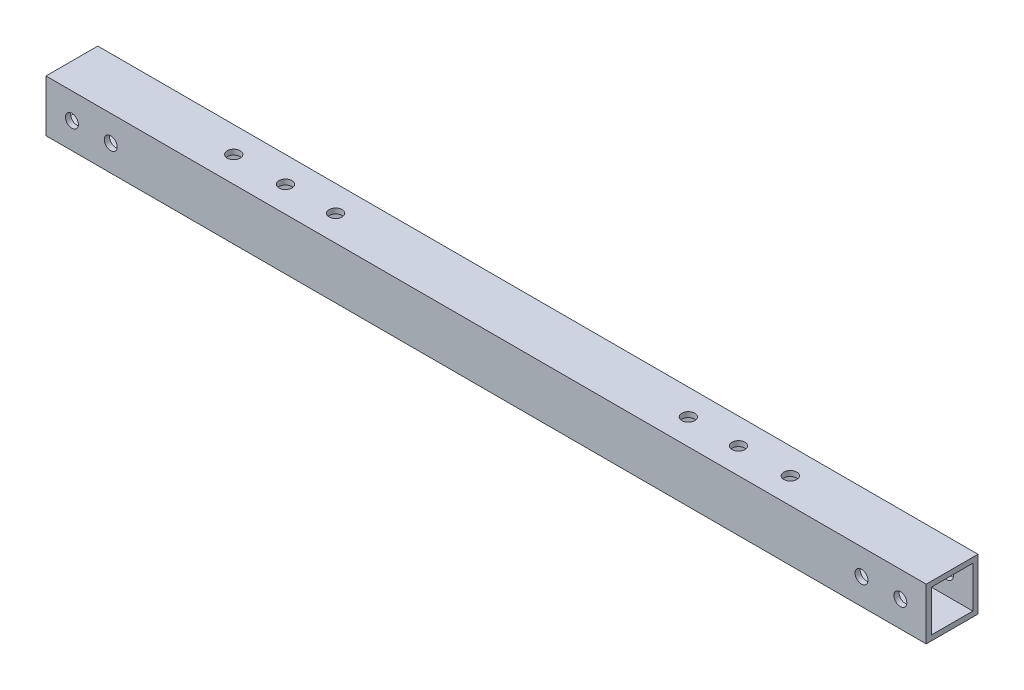
ISO-10303-21;
HEADER;
FILE_DESCRIPTION(('STEP AP214'),'2;1');
FILE_NAME('part.step','',(''),(''),'','','');
FILE_SCHEMA(('AUTOMOTIVE_DESIGN { 1 0 10303 214 1 1 1 1 }'));
ENDSEC;
DATA;
#1=APPLICATION_CONTEXT('core data for automotive mechanical design processes');
#2=APPLICATION_PROTOCOL_DEFINITION('international standard','automotive_design',2000,#1);
#3=PRODUCT_CONTEXT('',#1,'mechanical');
#4=PRODUCT('Part','Part','',(#3));
#5=PRODUCT_RELATED_PRODUCT_CATEGORY('part','',(#4));
#6=PRODUCT_DEFINITION_FORMATION('','',#4);
#7=PRODUCT_DEFINITION_CONTEXT('part definition',#1,'design');
#8=PRODUCT_DEFINITION('design','',#6,#7);
#9=PRODUCT_DEFINITION_SHAPE('','',#8);
#10=(LENGTH_UNIT() NAMED_UNIT(*) SI_UNIT(.MILLI.,.METRE.));
#11=(NAMED_UNIT(*) PLANE_ANGLE_UNIT() SI_UNIT($,.RADIAN.));
#12=(NAMED_UNIT(*) SI_UNIT($,.STERADIAN.) SOLID_ANGLE_UNIT());
#13=UNCERTAINTY_MEASURE_WITH_UNIT(LENGTH_MEASURE(1.E-05),#10,'distance_accuracy_value','');
#14=(GEOMETRIC_REPRESENTATION_CONTEXT(3) GLOBAL_UNCERTAINTY_ASSIGNED_CONTEXT((#13)) GLOBAL_UNIT_ASSIGNED_CONTEXT((#10,
#11,#12)) REPRESENTATION_CONTEXT('',''));
#15=CARTESIAN_POINT('',(0.,0.,0.));
#16=DIRECTION('',(0.,0.,1.));
#17=DIRECTION('',(1.,0.,0.));
#18=AXIS2_PLACEMENT_3D('',#15,#16,#17);
#19=CARTESIAN_POINT('',(340.,0.,0.));
#20=DIRECTION('',(1.,0.,0.));
#21=DIRECTION('',(0.,0.,-1.));
#22=AXIS2_PLACEMENT_3D('',#19,#20,#21);
#23=PLANE('',#22);
#24=DIRECTION('',(0.,1.,0.));
#25=VECTOR('',#24,1.);
#26=CARTESIAN_POINT('',(340.,10.,-10.));
#27=LINE('',#26,#25);
#28=CARTESIAN_POINT('',(340.,-10.,-10.));
#29=VERTEX_POINT('',#28);
#30=CARTESIAN_POINT('',(340.,10.,-10.));
#31=VERTEX_POINT('',#30);
#32=EDGE_CURVE('E141',#29,#31,#27,.T.);
#33=ORIENTED_EDGE('',*,*,#32,.T.);
#34=DIRECTION('',(0.,0.,1.));
#35=VECTOR('',#34,1.);
#36=CARTESIAN_POINT('',(340.,10.,10.));
#37=LINE('',#36,#35);
#38=CARTESIAN_POINT('',(340.,10.,10.));
#39=VERTEX_POINT('',#38);
#40=EDGE_CURVE('E144',#31,#39,#37,.T.);
#41=ORIENTED_EDGE('',*,*,#40,.T.);
#42=DIRECTION('',(0.,-1.,0.));
#43=VECTOR('',#42,1.);
#44=CARTESIAN_POINT('',(340.,10.,10.));
#45=LINE('',#44,#43);
#46=CARTESIAN_POINT('',(340.,-10.,10.));
#47=VERTEX_POINT('',#46);
#48=EDGE_CURVE('E147',#39,#47,#45,.T.);
#49=ORIENTED_EDGE('',*,*,#48,.T.);
#50=DIRECTION('',(0.,0.,-1.));
#51=VECTOR('',#50,1.);
#52=CARTESIAN_POINT('',(340.,-10.,10.));
#53=LINE('',#52,#51);
#54=EDGE_CURVE('E149',#47,#29,#53,.T.);
#55=ORIENTED_EDGE('',*,*,#54,.T.);
#56=EDGE_LOOP('',(#33,#41,#49,#55));
#57=FACE_BOUND('',#56,.T.);
#58=DIRECTION('',(0.,0.,1.));
#59=VECTOR('',#58,1.);
#60=CARTESIAN_POINT('',(340.,8.,8.));
#61=LINE('',#60,#59);
#62=CARTESIAN_POINT('',(340.,8.,-8.));
#63=VERTEX_POINT('',#62);
#64=CARTESIAN_POINT('',(340.,8.,8.));
#65=VERTEX_POINT('',#64);
#66=EDGE_CURVE('E111',#63,#65,#61,.T.);
#67=ORIENTED_EDGE('',*,*,#66,.F.);
#68=DIRECTION('',(0.,1.,0.));
#69=VECTOR('',#68,1.);
#70=CARTESIAN_POINT('',(340.,8.,-8.));
#71=LINE('',#70,#69);
#72=CARTESIAN_POINT('',(340.,-8.,-8.));
#73=VERTEX_POINT('',#72);
#74=EDGE_CURVE('E103',#73,#63,#71,.T.);
#75=ORIENTED_EDGE('',*,*,#74,.F.);
#76=DIRECTION('',(0.,0.,-1.));
#77=VECTOR('',#76,1.);
#78=CARTESIAN_POINT('',(340.,-8.,8.));
#79=LINE('',#78,#77);
#80=CARTESIAN_POINT('',(340.,-8.,8.));
#81=VERTEX_POINT('',#80);
#82=EDGE_CURVE('E125',#81,#73,#79,.T.);
#83=ORIENTED_EDGE('',*,*,#82,.F.);
#84=DIRECTION('',(0.,-1.,0.));
#85=VECTOR('',#84,1.);
#86=CARTESIAN_POINT('',(340.,8.,8.));
#87=LINE('',#86,#85);
#88=EDGE_CURVE('E123',#65,#81,#87,.T.);
#89=ORIENTED_EDGE('',*,*,#88,.F.);
#90=EDGE_LOOP('',(#67,#75,#83,#89));
#91=FACE_BOUND('',#90,.T.);
#92=ADVANCED_FACE('F36',(#57,#91),#23,.T.);
#93=CARTESIAN_POINT('',(0.,0.,0.));
#94=DIRECTION('',(1.,0.,0.));
#95=DIRECTION('',(0.,0.,-1.));
#96=AXIS2_PLACEMENT_3D('',#93,#94,#95);
#97=PLANE('',#96);
#98=DIRECTION('',(0.,1.,0.));
#99=VECTOR('',#98,1.);
#100=CARTESIAN_POINT('',(0.,10.,-10.));
#101=LINE('',#100,#99);
#102=CARTESIAN_POINT('',(0.,-10.,-10.));
#103=VERTEX_POINT('',#102);
#104=CARTESIAN_POINT('',(0.,10.,-10.));
#105=VERTEX_POINT('',#104);
#106=EDGE_CURVE('E119',#103,#105,#101,.T.);
#107=ORIENTED_EDGE('',*,*,#106,.F.);
#108=DIRECTION('',(0.,0.,-1.));
#109=VECTOR('',#108,1.);
#110=CARTESIAN_POINT('',(0.,-10.,10.));
#111=LINE('',#110,#109);
#112=CARTESIAN_POINT('',(0.,-10.,10.));
#113=VERTEX_POINT('',#112);
#114=EDGE_CURVE('E145',#113,#103,#111,.T.);
#115=ORIENTED_EDGE('',*,*,#114,.F.);
#116=DIRECTION('',(0.,-1.,0.));
#117=VECTOR('',#116,1.);
#118=CARTESIAN_POINT('',(0.,10.,10.));
#119=LINE('',#118,#117);
#120=CARTESIAN_POINT('',(0.,10.,10.));
#121=VERTEX_POINT('',#120);
#122=EDGE_CURVE('E156',#121,#113,#119,.T.);
#123=ORIENTED_EDGE('',*,*,#122,.F.);
#124=DIRECTION('',(0.,0.,1.));
#125=VECTOR('',#124,1.);
#126=CARTESIAN_POINT('',(0.,10.,10.));
#127=LINE('',#126,#125);
#128=EDGE_CURVE('E154',#105,#121,#127,.T.);
#129=ORIENTED_EDGE('',*,*,#128,.F.);
#130=EDGE_LOOP('',(#107,#115,#123,#129));
#131=FACE_BOUND('',#130,.T.);
#132=DIRECTION('',(0.,1.,0.));
#133=VECTOR('',#132,1.);
#134=CARTESIAN_POINT('',(0.,8.,-8.));
#135=LINE('',#134,#133);
#136=CARTESIAN_POINT('',(0.,-8.,-8.));
#137=VERTEX_POINT('',#136);
#138=CARTESIAN_POINT('',(0.,8.,-8.));
#139=VERTEX_POINT('',#138);
#140=EDGE_CURVE('E61',#137,#139,#135,.T.);
#141=ORIENTED_EDGE('',*,*,#140,.T.);
#142=DIRECTION('',(0.,0.,1.));
#143=VECTOR('',#142,1.);
#144=CARTESIAN_POINT('',(0.,8.,8.));
#145=LINE('',#144,#143);
#146=CARTESIAN_POINT('',(0.,8.,8.));
#147=VERTEX_POINT('',#146);
#148=EDGE_CURVE('E118',#139,#147,#145,.T.);
#149=ORIENTED_EDGE('',*,*,#148,.T.);
#150=DIRECTION('',(0.,-1.,0.));
#151=VECTOR('',#150,1.);
#152=CARTESIAN_POINT('',(0.,8.,8.));
#153=LINE('',#152,#151);
#154=CARTESIAN_POINT('',(0.,-8.,8.));
#155=VERTEX_POINT('',#154);
#156=EDGE_CURVE('E133',#147,#155,#153,.T.);
#157=ORIENTED_EDGE('',*,*,#156,.T.);
#158=DIRECTION('',(0.,0.,-1.));
#159=VECTOR('',#158,1.);
#160=CARTESIAN_POINT('',(0.,-8.,8.));
#161=LINE('',#160,#159);
#162=EDGE_CURVE('E112',#155,#137,#161,.T.);
#163=ORIENTED_EDGE('',*,*,#162,.T.);
#164=EDGE_LOOP('',(#141,#149,#157,#163));
#165=FACE_BOUND('',#164,.T.);
#166=ADVANCED_FACE('F310',(#131,#165),#97,.F.);
#167=CARTESIAN_POINT('',(340.,10.,-10.));
#168=DIRECTION('',(0.,0.,1.));
#169=DIRECTION('',(1.,0.,0.));
#170=AXIS2_PLACEMENT_3D('',#167,#168,#169);
#171=PLANE('',#170);
#172=CARTESIAN_POINT('',(10.,0.,-10.));
#173=DIRECTION('',(0.,0.,1.));
#174=DIRECTION('',(1.,0.,0.));
#175=AXIS2_PLACEMENT_3D('',#172,#173,#174);
#176=CIRCLE('',#175,2.5);
#177=CARTESIAN_POINT('',(12.5,0.,-10.));
#178=VERTEX_POINT('',#177);
#179=EDGE_CURVE('E170',#178,#178,#176,.T.);
#180=ORIENTED_EDGE('',*,*,#179,.T.);
#181=EDGE_LOOP('',(#180));
#182=FACE_BOUND('',#181,.T.);
#183=CARTESIAN_POINT('',(25.,0.,-10.));
#184=DIRECTION('',(0.,0.,1.));
#185=DIRECTION('',(1.,0.,0.));
#186=AXIS2_PLACEMENT_3D('',#183,#184,#185);
#187=CIRCLE('',#186,2.5);
#188=CARTESIAN_POINT('',(27.5,0.,-10.));
#189=VERTEX_POINT('',#188);
#190=EDGE_CURVE('E260',#189,#189,#187,.T.);
#191=ORIENTED_EDGE('',*,*,#190,.T.);
#192=EDGE_LOOP('',(#191));
#193=FACE_BOUND('',#192,.T.);
#194=CARTESIAN_POINT('',(315.,1.0654427152582E-13,-10.));
#195=DIRECTION('',(0.,0.,1.));
#196=DIRECTION('',(-1.,0.,0.));
#197=AXIS2_PLACEMENT_3D('',#194,#195,#196);
#198=CIRCLE('',#197,2.49999999999996);
#199=CARTESIAN_POINT('',(312.5,1.0654427152582E-13,-10.));
#200=VERTEX_POINT('',#199);
#201=EDGE_CURVE('E266',#200,#200,#198,.T.);
#202=ORIENTED_EDGE('',*,*,#201,.T.);
#203=EDGE_LOOP('',(#202));
#204=FACE_BOUND('',#203,.T.);
#205=CARTESIAN_POINT('',(330.,1.17566092718146E-13,-10.));
#206=DIRECTION('',(0.,0.,1.));
#207=DIRECTION('',(-1.,0.,0.));
#208=AXIS2_PLACEMENT_3D('',#205,#206,#207);
#209=CIRCLE('',#208,2.50000000000002);
#210=CARTESIAN_POINT('',(327.5,1.17566092718146E-13,-10.));
#211=VERTEX_POINT('',#210);
#212=EDGE_CURVE('E272',#211,#211,#209,.T.);
#213=ORIENTED_EDGE('',*,*,#212,.T.);
#214=EDGE_LOOP('',(#213));
#215=FACE_BOUND('',#214,.T.);
#216=ORIENTED_EDGE('',*,*,#106,.T.);
#217=DIRECTION('',(-1.,0.,0.));
#218=VECTOR('',#217,1.);
#219=CARTESIAN_POINT('',(340.,10.,-10.));
#220=LINE('',#219,#218);
#221=EDGE_CURVE('E11',#31,#105,#220,.T.);
#222=ORIENTED_EDGE('',*,*,#221,.F.);
#223=ORIENTED_EDGE('',*,*,#32,.F.);
#224=DIRECTION('',(-1.,0.,0.));
#225=VECTOR('',#224,1.);
#226=CARTESIAN_POINT('',(340.,-10.,-10.));
#227=LINE('',#226,#225);
#228=EDGE_CURVE('E151',#29,#103,#227,.T.);
#229=ORIENTED_EDGE('',*,*,#228,.T.);
#230=EDGE_LOOP('',(#216,#222,#223,#229));
#231=FACE_BOUND('',#230,.T.);
#232=ADVANCED_FACE('F38',(#182,#193,#204,#215,#231),#171,.F.);
#233=CARTESIAN_POINT('',(340.,10.,10.));
#234=DIRECTION('',(0.,-1.,0.));
#235=DIRECTION('',(0.,0.,-1.));
#236=AXIS2_PLACEMENT_3D('',#233,#234,#235);
#237=PLANE('',#236);
#238=CARTESIAN_POINT('',(101.88,10.,0.));
#239=DIRECTION('',(0.,1.,0.));
#240=DIRECTION('',(0.,0.,1.));
#241=AXIS2_PLACEMENT_3D('',#238,#239,#240);
#242=CIRCLE('',#241,2.49999999999999);
#243=CARTESIAN_POINT('',(101.88,10.,2.49999999999999));
#244=VERTEX_POINT('',#243);
#245=EDGE_CURVE('E207',#244,#244,#242,.T.);
#246=ORIENTED_EDGE('',*,*,#245,.F.);
#247=EDGE_LOOP('',(#246));
#248=FACE_BOUND('',#247,.T.);
#249=CARTESIAN_POINT('',(238.12,10.,0.));
#250=DIRECTION('',(0.,1.,0.));
#251=DIRECTION('',(0.,0.,-1.));
#252=AXIS2_PLACEMENT_3D('',#249,#250,#251);
#253=CIRCLE('',#252,2.50000000000002);
#254=CARTESIAN_POINT('',(238.12,10.,-2.50000000000002));
#255=VERTEX_POINT('',#254);
#256=EDGE_CURVE('E217',#255,#255,#253,.T.);
#257=ORIENTED_EDGE('',*,*,#256,.F.);
#258=EDGE_LOOP('',(#257));
#259=FACE_BOUND('',#258,.T.);
#260=CARTESIAN_POINT('',(62.5,10.,0.));
#261=DIRECTION('',(0.,1.,0.));
#262=DIRECTION('',(0.,0.,1.));
#263=AXIS2_PLACEMENT_3D('',#260,#261,#262);
#264=CIRCLE('',#263,2.5);
#265=CARTESIAN_POINT('',(62.5,10.,2.5));
#266=VERTEX_POINT('',#265);
#267=EDGE_CURVE('E226',#266,#266,#264,.T.);
#268=ORIENTED_EDGE('',*,*,#267,.F.);
#269=EDGE_LOOP('',(#268));
#270=FACE_BOUND('',#269,.T.);
#271=CARTESIAN_POINT('',(82.5,10.,0.));
#272=DIRECTION('',(0.,1.,0.));
#273=DIRECTION('',(0.,0.,-1.));
#274=AXIS2_PLACEMENT_3D('',#271,#272,#273);
#275=CIRCLE('',#274,2.5);
#276=CARTESIAN_POINT('',(82.5,10.,-2.49999999999999));
#277=VERTEX_POINT('',#276);
#278=EDGE_CURVE('E232',#277,#277,#275,.T.);
#279=ORIENTED_EDGE('',*,*,#278,.F.);
#280=EDGE_LOOP('',(#279));
#281=FACE_BOUND('',#280,.T.);
#282=CARTESIAN_POINT('',(257.5,10.,0.));
#283=DIRECTION('',(0.,1.,0.));
#284=DIRECTION('',(0.,0.,1.));
#285=AXIS2_PLACEMENT_3D('',#282,#283,#284);
#286=CIRCLE('',#285,2.49999999999997);
#287=CARTESIAN_POINT('',(257.5,10.,2.49999999999997));
#288=VERTEX_POINT('',#287);
#289=EDGE_CURVE('E238',#288,#288,#286,.T.);
#290=ORIENTED_EDGE('',*,*,#289,.F.);
#291=EDGE_LOOP('',(#290));
#292=FACE_BOUND('',#291,.T.);
#293=CARTESIAN_POINT('',(277.5,10.,0.));
#294=DIRECTION('',(0.,1.,0.));
#295=DIRECTION('',(0.,0.,-1.));
#296=AXIS2_PLACEMENT_3D('',#293,#294,#295);
#297=CIRCLE('',#296,2.49999999999997);
#298=CARTESIAN_POINT('',(277.5,10.,-2.49999999999997));
#299=VERTEX_POINT('',#298);
#300=EDGE_CURVE('E223',#299,#299,#297,.T.);
#301=ORIENTED_EDGE('',*,*,#300,.F.);
#302=EDGE_LOOP('',(#301));
#303=FACE_BOUND('',#302,.T.);
#304=ORIENTED_EDGE('',*,*,#128,.T.);
#305=DIRECTION('',(-1.,0.,0.));
#306=VECTOR('',#305,1.);
#307=CARTESIAN_POINT('',(340.,10.,10.));
#308=LINE('',#307,#306);
#309=EDGE_CURVE('E45',#39,#121,#308,.T.);
#310=ORIENTED_EDGE('',*,*,#309,.F.);
#311=ORIENTED_EDGE('',*,*,#40,.F.);
#312=ORIENTED_EDGE('',*,*,#221,.T.);
#313=EDGE_LOOP('',(#304,#310,#311,#312));
#314=FACE_BOUND('',#313,.T.);
#315=ADVANCED_FACE('F309',(#248,#259,#270,#281,#292,#303,#314),#237,.F.);
#316=CARTESIAN_POINT('',(340.,10.,10.));
#317=DIRECTION('',(0.,0.,-1.));
#318=DIRECTION('',(-1.,0.,0.));
#319=AXIS2_PLACEMENT_3D('',#316,#317,#318);
#320=PLANE('',#319);
#321=CARTESIAN_POINT('',(10.,0.,10.));
#322=DIRECTION('',(0.,0.,1.));
#323=DIRECTION('',(1.,0.,0.));
#324=AXIS2_PLACEMENT_3D('',#321,#322,#323);
#325=CIRCLE('',#324,2.5);
#326=CARTESIAN_POINT('',(12.5,0.,10.));
#327=VERTEX_POINT('',#326);
#328=EDGE_CURVE('E257',#327,#327,#325,.T.);
#329=ORIENTED_EDGE('',*,*,#328,.F.);
#330=EDGE_LOOP('',(#329));
#331=FACE_BOUND('',#330,.T.);
#332=CARTESIAN_POINT('',(25.,0.,10.));
#333=DIRECTION('',(0.,0.,1.));
#334=DIRECTION('',(1.,0.,0.));
#335=AXIS2_PLACEMENT_3D('',#332,#333,#334);
#336=CIRCLE('',#335,2.5);
#337=CARTESIAN_POINT('',(27.5,0.,10.));
#338=VERTEX_POINT('',#337);
#339=EDGE_CURVE('E263',#338,#338,#336,.T.);
#340=ORIENTED_EDGE('',*,*,#339,.F.);
#341=EDGE_LOOP('',(#340));
#342=FACE_BOUND('',#341,.T.);
#343=CARTESIAN_POINT('',(315.,1.0654427152582E-13,10.));
#344=DIRECTION('',(0.,0.,1.));
#345=DIRECTION('',(-1.,0.,0.));
#346=AXIS2_PLACEMENT_3D('',#343,#344,#345);
#347=CIRCLE('',#346,2.49999999999996);
#348=CARTESIAN_POINT('',(312.5,1.0654427152582E-13,10.));
#349=VERTEX_POINT('',#348);
#350=EDGE_CURVE('E269',#349,#349,#347,.T.);
#351=ORIENTED_EDGE('',*,*,#350,.F.);
#352=EDGE_LOOP('',(#351));
#353=FACE_BOUND('',#352,.T.);
#354=CARTESIAN_POINT('',(330.,1.17566092718146E-13,10.));
#355=DIRECTION('',(0.,0.,1.));
#356=DIRECTION('',(-1.,0.,0.));
#357=AXIS2_PLACEMENT_3D('',#354,#355,#356);
#358=CIRCLE('',#357,2.50000000000002);
#359=CARTESIAN_POINT('',(327.5,1.17566092718146E-13,10.));
#360=VERTEX_POINT('',#359);
#361=EDGE_CURVE('E254',#360,#360,#358,.T.);
#362=ORIENTED_EDGE('',*,*,#361,.F.);
#363=EDGE_LOOP('',(#362));
#364=FACE_BOUND('',#363,.T.);
#365=ORIENTED_EDGE('',*,*,#122,.T.);
#366=DIRECTION('',(-1.,0.,0.));
#367=VECTOR('',#366,1.);
#368=CARTESIAN_POINT('',(340.,-10.,10.));
#369=LINE('',#368,#367);
#370=EDGE_CURVE('E161',#47,#113,#369,.T.);
#371=ORIENTED_EDGE('',*,*,#370,.F.);
#372=ORIENTED_EDGE('',*,*,#48,.F.);
#373=ORIENTED_EDGE('',*,*,#309,.T.);
#374=EDGE_LOOP('',(#365,#371,#372,#373));
#375=FACE_BOUND('',#374,.T.);
#376=ADVANCED_FACE('F328',(#331,#342,#353,#364,#375),#320,.F.);
#377=CARTESIAN_POINT('',(340.,-10.,10.));
#378=DIRECTION('',(0.,1.,0.));
#379=DIRECTION('',(0.,0.,1.));
#380=AXIS2_PLACEMENT_3D('',#377,#378,#379);
#381=PLANE('',#380);
#382=CARTESIAN_POINT('',(101.88,-9.99999999999999,0.));
#383=DIRECTION('',(0.,1.,0.));
#384=DIRECTION('',(0.,0.,1.));
#385=AXIS2_PLACEMENT_3D('',#382,#383,#384);
#386=CIRCLE('',#385,2.49999999999999);
#387=CARTESIAN_POINT('',(101.88,-9.99999999999999,2.49999999999999));
#388=VERTEX_POINT('',#387);
#389=EDGE_CURVE('E201',#388,#388,#386,.T.);
#390=ORIENTED_EDGE('',*,*,#389,.T.);
#391=EDGE_LOOP('',(#390));
#392=FACE_BOUND('',#391,.T.);
#393=CARTESIAN_POINT('',(238.12,-9.99999999999999,0.));
#394=DIRECTION('',(0.,1.,0.));
#395=DIRECTION('',(0.,0.,-1.));
#396=AXIS2_PLACEMENT_3D('',#393,#394,#395);
#397=CIRCLE('',#396,2.50000000000002);
#398=CARTESIAN_POINT('',(238.12,-9.99999999999999,-2.50000000000002));
#399=VERTEX_POINT('',#398);
#400=EDGE_CURVE('E212',#399,#399,#397,.T.);
#401=ORIENTED_EDGE('',*,*,#400,.T.);
#402=EDGE_LOOP('',(#401));
#403=FACE_BOUND('',#402,.T.);
#404=CARTESIAN_POINT('',(62.5,-9.99999999999999,0.));
#405=DIRECTION('',(0.,1.,0.));
#406=DIRECTION('',(0.,0.,1.));
#407=AXIS2_PLACEMENT_3D('',#404,#405,#406);
#408=CIRCLE('',#407,2.5);
#409=CARTESIAN_POINT('',(62.5,-9.99999999999999,2.49999999999999));
#410=VERTEX_POINT('',#409);
#411=EDGE_CURVE('E186',#410,#410,#408,.T.);
#412=ORIENTED_EDGE('',*,*,#411,.T.);
#413=EDGE_LOOP('',(#412));
#414=FACE_BOUND('',#413,.T.);
#415=CARTESIAN_POINT('',(82.5,-9.99999999999999,0.));
#416=DIRECTION('',(0.,1.,0.));
#417=DIRECTION('',(0.,0.,-1.));
#418=AXIS2_PLACEMENT_3D('',#415,#416,#417);
#419=CIRCLE('',#418,2.5);
#420=CARTESIAN_POINT('',(82.5,-9.99999999999999,-2.5));
#421=VERTEX_POINT('',#420);
#422=EDGE_CURVE('E229',#421,#421,#419,.T.);
#423=ORIENTED_EDGE('',*,*,#422,.T.);
#424=EDGE_LOOP('',(#423));
#425=FACE_BOUND('',#424,.T.);
#426=CARTESIAN_POINT('',(257.5,-9.99999999999999,0.));
#427=DIRECTION('',(0.,1.,0.));
#428=DIRECTION('',(0.,0.,1.));
#429=AXIS2_PLACEMENT_3D('',#426,#427,#428);
#430=CIRCLE('',#429,2.49999999999997);
#431=CARTESIAN_POINT('',(257.5,-9.99999999999999,2.49999999999997));
#432=VERTEX_POINT('',#431);
#433=EDGE_CURVE('E235',#432,#432,#430,.T.);
#434=ORIENTED_EDGE('',*,*,#433,.T.);
#435=EDGE_LOOP('',(#434));
#436=FACE_BOUND('',#435,.T.);
#437=CARTESIAN_POINT('',(277.5,-9.99999999999999,0.));
#438=DIRECTION('',(0.,1.,0.));
#439=DIRECTION('',(0.,0.,-1.));
#440=AXIS2_PLACEMENT_3D('',#437,#438,#439);
#441=CIRCLE('',#440,2.49999999999997);
#442=CARTESIAN_POINT('',(277.5,-9.99999999999999,-2.49999999999997));
#443=VERTEX_POINT('',#442);
#444=EDGE_CURVE('E241',#443,#443,#441,.T.);
#445=ORIENTED_EDGE('',*,*,#444,.T.);
#446=EDGE_LOOP('',(#445));
#447=FACE_BOUND('',#446,.T.);
#448=ORIENTED_EDGE('',*,*,#114,.T.);
#449=ORIENTED_EDGE('',*,*,#228,.F.);
#450=ORIENTED_EDGE('',*,*,#54,.F.);
#451=ORIENTED_EDGE('',*,*,#370,.T.);
#452=EDGE_LOOP('',(#448,#449,#450,#451));
#453=FACE_BOUND('',#452,.T.);
#454=ADVANCED_FACE('F290',(#392,#403,#414,#425,#436,#447,#453),#381,.F.);
#455=CARTESIAN_POINT('',(340.,8.,-8.));
#456=DIRECTION('',(0.,0.,1.));
#457=DIRECTION('',(1.,0.,0.));
#458=AXIS2_PLACEMENT_3D('',#455,#456,#457);
#459=PLANE('',#458);
#460=CARTESIAN_POINT('',(10.,0.,-8.));
#461=DIRECTION('',(0.,0.,1.));
#462=DIRECTION('',(1.,0.,0.));
#463=AXIS2_PLACEMENT_3D('',#460,#461,#462);
#464=CIRCLE('',#463,2.5);
#465=CARTESIAN_POINT('',(12.5,0.,-8.));
#466=VERTEX_POINT('',#465);
#467=EDGE_CURVE('E131',#466,#466,#464,.T.);
#468=ORIENTED_EDGE('',*,*,#467,.F.);
#469=EDGE_LOOP('',(#468));
#470=FACE_BOUND('',#469,.T.);
#471=CARTESIAN_POINT('',(25.,0.,-8.));
#472=DIRECTION('',(0.,0.,1.));
#473=DIRECTION('',(1.,0.,0.));
#474=AXIS2_PLACEMENT_3D('',#471,#472,#473);
#475=CIRCLE('',#474,2.5);
#476=CARTESIAN_POINT('',(27.5,0.,-8.));
#477=VERTEX_POINT('',#476);
#478=EDGE_CURVE('E178',#477,#477,#475,.T.);
#479=ORIENTED_EDGE('',*,*,#478,.F.);
#480=EDGE_LOOP('',(#479));
#481=FACE_BOUND('',#480,.T.);
#482=CARTESIAN_POINT('',(315.,1.0654427152582E-13,-8.));
#483=DIRECTION('',(0.,0.,1.));
#484=DIRECTION('',(1.,0.,0.));
#485=AXIS2_PLACEMENT_3D('',#482,#483,#484);
#486=CIRCLE('',#485,2.49999999999996);
#487=CARTESIAN_POINT('',(317.5,1.0654427152582E-13,-8.));
#488=VERTEX_POINT('',#487);
#489=EDGE_CURVE('E174',#488,#488,#486,.T.);
#490=ORIENTED_EDGE('',*,*,#489,.F.);
#491=EDGE_LOOP('',(#490));
#492=FACE_BOUND('',#491,.T.);
#493=CARTESIAN_POINT('',(330.,1.17566092718146E-13,-8.));
#494=DIRECTION('',(0.,0.,1.));
#495=DIRECTION('',(1.,0.,0.));
#496=AXIS2_PLACEMENT_3D('',#493,#494,#495);
#497=CIRCLE('',#496,2.50000000000002);
#498=CARTESIAN_POINT('',(332.5,1.17566092718146E-13,-8.));
#499=VERTEX_POINT('',#498);
#500=EDGE_CURVE('E169',#499,#499,#497,.T.);
#501=ORIENTED_EDGE('',*,*,#500,.F.);
#502=EDGE_LOOP('',(#501));
#503=FACE_BOUND('',#502,.T.);
#504=ORIENTED_EDGE('',*,*,#140,.F.);
#505=DIRECTION('',(-1.,0.,0.));
#506=VECTOR('',#505,1.);
#507=CARTESIAN_POINT('',(340.,-8.,-8.));
#508=LINE('',#507,#506);
#509=EDGE_CURVE('E107',#73,#137,#508,.T.);
#510=ORIENTED_EDGE('',*,*,#509,.F.);
#511=ORIENTED_EDGE('',*,*,#74,.T.);
#512=DIRECTION('',(-1.,0.,0.));
#513=VECTOR('',#512,1.);
#514=CARTESIAN_POINT('',(340.,8.,-8.));
#515=LINE('',#514,#513);
#516=EDGE_CURVE('E106',#63,#139,#515,.T.);
#517=ORIENTED_EDGE('',*,*,#516,.T.);
#518=EDGE_LOOP('',(#504,#510,#511,#517));
#519=FACE_BOUND('',#518,.T.);
#520=ADVANCED_FACE('F105',(#470,#481,#492,#503,#519),#459,.T.);
#521=CARTESIAN_POINT('',(340.,8.,8.));
#522=DIRECTION('',(0.,-1.,0.));
#523=DIRECTION('',(0.,0.,-1.));
#524=AXIS2_PLACEMENT_3D('',#521,#522,#523);
#525=PLANE('',#524);
#526=CARTESIAN_POINT('',(101.88,8.,0.));
#527=DIRECTION('',(0.,-1.,0.));
#528=DIRECTION('',(0.,0.,-1.));
#529=AXIS2_PLACEMENT_3D('',#526,#527,#528);
#530=CIRCLE('',#529,2.49999999999999);
#531=CARTESIAN_POINT('',(101.88,8.,-2.49999999999999));
#532=VERTEX_POINT('',#531);
#533=EDGE_CURVE('E220',#532,#532,#530,.T.);
#534=ORIENTED_EDGE('',*,*,#533,.F.);
#535=EDGE_LOOP('',(#534));
#536=FACE_BOUND('',#535,.T.);
#537=CARTESIAN_POINT('',(238.12,8.,0.));
#538=DIRECTION('',(0.,-1.,0.));
#539=DIRECTION('',(0.,0.,-1.));
#540=AXIS2_PLACEMENT_3D('',#537,#538,#539);
#541=CIRCLE('',#540,2.50000000000002);
#542=CARTESIAN_POINT('',(238.12,8.,-2.50000000000002));
#543=VERTEX_POINT('',#542);
#544=EDGE_CURVE('E200',#543,#543,#541,.T.);
#545=ORIENTED_EDGE('',*,*,#544,.F.);
#546=EDGE_LOOP('',(#545));
#547=FACE_BOUND('',#546,.T.);
#548=CARTESIAN_POINT('',(62.5,8.,0.));
#549=DIRECTION('',(0.,-1.,0.));
#550=DIRECTION('',(0.,0.,-1.));
#551=AXIS2_PLACEMENT_3D('',#548,#549,#550);
#552=CIRCLE('',#551,2.5);
#553=CARTESIAN_POINT('',(62.5,8.,-2.49999999999999));
#554=VERTEX_POINT('',#553);
#555=EDGE_CURVE('E197',#554,#554,#552,.T.);
#556=ORIENTED_EDGE('',*,*,#555,.F.);
#557=EDGE_LOOP('',(#556));
#558=FACE_BOUND('',#557,.T.);
#559=CARTESIAN_POINT('',(82.5,8.,0.));
#560=DIRECTION('',(0.,-1.,0.));
#561=DIRECTION('',(0.,0.,-1.));
#562=AXIS2_PLACEMENT_3D('',#559,#560,#561);
#563=CIRCLE('',#562,2.5);
#564=CARTESIAN_POINT('',(82.5,8.,-2.49999999999999));
#565=VERTEX_POINT('',#564);
#566=EDGE_CURVE('E194',#565,#565,#563,.T.);
#567=ORIENTED_EDGE('',*,*,#566,.F.);
#568=EDGE_LOOP('',(#567));
#569=FACE_BOUND('',#568,.T.);
#570=CARTESIAN_POINT('',(257.5,8.,0.));
#571=DIRECTION('',(0.,-1.,0.));
#572=DIRECTION('',(0.,0.,-1.));
#573=AXIS2_PLACEMENT_3D('',#570,#571,#572);
#574=CIRCLE('',#573,2.49999999999997);
#575=CARTESIAN_POINT('',(257.5,8.,-2.49999999999997));
#576=VERTEX_POINT('',#575);
#577=EDGE_CURVE('E190',#576,#576,#574,.T.);
#578=ORIENTED_EDGE('',*,*,#577,.F.);
#579=EDGE_LOOP('',(#578));
#580=FACE_BOUND('',#579,.T.);
#581=CARTESIAN_POINT('',(277.5,8.,0.));
#582=DIRECTION('',(0.,-1.,0.));
#583=DIRECTION('',(0.,0.,-1.));
#584=AXIS2_PLACEMENT_3D('',#581,#582,#583);
#585=CIRCLE('',#584,2.49999999999997);
#586=CARTESIAN_POINT('',(277.5,8.,-2.49999999999997));
#587=VERTEX_POINT('',#586);
#588=EDGE_CURVE('E185',#587,#587,#585,.T.);
#589=ORIENTED_EDGE('',*,*,#588,.F.);
#590=EDGE_LOOP('',(#589));
#591=FACE_BOUND('',#590,.T.);
#592=ORIENTED_EDGE('',*,*,#148,.F.);
#593=ORIENTED_EDGE('',*,*,#516,.F.);
#594=ORIENTED_EDGE('',*,*,#66,.T.);
#595=DIRECTION('',(-1.,0.,0.));
#596=VECTOR('',#595,1.);
#597=CARTESIAN_POINT('',(340.,8.,8.));
#598=LINE('',#597,#596);
#599=EDGE_CURVE('E120',#65,#147,#598,.T.);
#600=ORIENTED_EDGE('',*,*,#599,.T.);
#601=EDGE_LOOP('',(#592,#593,#594,#600));
#602=FACE_BOUND('',#601,.T.);
#603=ADVANCED_FACE('F115',(#536,#547,#558,#569,#580,#591,#602),#525,.T.);
#604=CARTESIAN_POINT('',(340.,8.,8.));
#605=DIRECTION('',(0.,0.,-1.));
#606=DIRECTION('',(-1.,0.,0.));
#607=AXIS2_PLACEMENT_3D('',#604,#605,#606);
#608=PLANE('',#607);
#609=CARTESIAN_POINT('',(10.,0.,8.));
#610=DIRECTION('',(0.,0.,-1.));
#611=DIRECTION('',(-1.,0.,0.));
#612=AXIS2_PLACEMENT_3D('',#609,#610,#611);
#613=CIRCLE('',#612,2.5);
#614=CARTESIAN_POINT('',(7.50000000000001,0.,8.));
#615=VERTEX_POINT('',#614);
#616=EDGE_CURVE('E179',#615,#615,#613,.T.);
#617=ORIENTED_EDGE('',*,*,#616,.F.);
#618=EDGE_LOOP('',(#617));
#619=FACE_BOUND('',#618,.T.);
#620=CARTESIAN_POINT('',(25.,0.,8.));
#621=DIRECTION('',(0.,0.,-1.));
#622=DIRECTION('',(-1.,0.,0.));
#623=AXIS2_PLACEMENT_3D('',#620,#621,#622);
#624=CIRCLE('',#623,2.5);
#625=CARTESIAN_POINT('',(22.5,0.,8.));
#626=VERTEX_POINT('',#625);
#627=EDGE_CURVE('E175',#626,#626,#624,.T.);
#628=ORIENTED_EDGE('',*,*,#627,.F.);
#629=EDGE_LOOP('',(#628));
#630=FACE_BOUND('',#629,.T.);
#631=CARTESIAN_POINT('',(315.,1.0654427152582E-13,8.));
#632=DIRECTION('',(0.,0.,-1.));
#633=DIRECTION('',(-1.,0.,0.));
#634=AXIS2_PLACEMENT_3D('',#631,#632,#633);
#635=CIRCLE('',#634,2.49999999999996);
#636=CARTESIAN_POINT('',(312.5,1.0654427152582E-13,8.));
#637=VERTEX_POINT('',#636);
#638=EDGE_CURVE('E171',#637,#637,#635,.T.);
#639=ORIENTED_EDGE('',*,*,#638,.F.);
#640=EDGE_LOOP('',(#639));
#641=FACE_BOUND('',#640,.T.);
#642=CARTESIAN_POINT('',(330.,1.17566092718146E-13,8.));
#643=DIRECTION('',(0.,0.,-1.));
#644=DIRECTION('',(-1.,0.,0.));
#645=AXIS2_PLACEMENT_3D('',#642,#643,#644);
#646=CIRCLE('',#645,2.50000000000002);
#647=CARTESIAN_POINT('',(327.5,1.17566092718146E-13,8.));
#648=VERTEX_POINT('',#647);
#649=EDGE_CURVE('E166',#648,#648,#646,.T.);
#650=ORIENTED_EDGE('',*,*,#649,.F.);
#651=EDGE_LOOP('',(#650));
#652=FACE_BOUND('',#651,.T.);
#653=ORIENTED_EDGE('',*,*,#156,.F.);
#654=ORIENTED_EDGE('',*,*,#599,.F.);
#655=ORIENTED_EDGE('',*,*,#88,.T.);
#656=DIRECTION('',(-1.,0.,0.));
#657=VECTOR('',#656,1.);
#658=CARTESIAN_POINT('',(340.,-8.,8.));
#659=LINE('',#658,#657);
#660=EDGE_CURVE('E53',#81,#155,#659,.T.);
#661=ORIENTED_EDGE('',*,*,#660,.T.);
#662=EDGE_LOOP('',(#653,#654,#655,#661));
#663=FACE_BOUND('',#662,.T.);
#664=ADVANCED_FACE('F351',(#619,#630,#641,#652,#663),#608,.T.);
#665=CARTESIAN_POINT('',(340.,-8.,8.));
#666=DIRECTION('',(0.,1.,0.));
#667=DIRECTION('',(0.,0.,1.));
#668=AXIS2_PLACEMENT_3D('',#665,#666,#667);
#669=PLANE('',#668);
#670=CARTESIAN_POINT('',(101.88,-8.,0.));
#671=DIRECTION('',(0.,1.,0.));
#672=DIRECTION('',(0.,0.,1.));
#673=AXIS2_PLACEMENT_3D('',#670,#671,#672);
#674=CIRCLE('',#673,2.49999999999999);
#675=CARTESIAN_POINT('',(101.88,-8.,2.49999999999999));
#676=VERTEX_POINT('',#675);
#677=EDGE_CURVE('E40',#676,#676,#674,.T.);
#678=ORIENTED_EDGE('',*,*,#677,.F.);
#679=EDGE_LOOP('',(#678));
#680=FACE_BOUND('',#679,.T.);
#681=CARTESIAN_POINT('',(238.12,-8.,0.));
#682=DIRECTION('',(0.,1.,0.));
#683=DIRECTION('',(0.,0.,1.));
#684=AXIS2_PLACEMENT_3D('',#681,#682,#683);
#685=CIRCLE('',#684,2.50000000000002);
#686=CARTESIAN_POINT('',(238.12,-8.,2.50000000000002));
#687=VERTEX_POINT('',#686);
#688=EDGE_CURVE('E198',#687,#687,#685,.T.);
#689=ORIENTED_EDGE('',*,*,#688,.F.);
#690=EDGE_LOOP('',(#689));
#691=FACE_BOUND('',#690,.T.);
#692=CARTESIAN_POINT('',(62.5,-8.,0.));
#693=DIRECTION('',(0.,1.,0.));
#694=DIRECTION('',(0.,0.,1.));
#695=AXIS2_PLACEMENT_3D('',#692,#693,#694);
#696=CIRCLE('',#695,2.5);
#697=CARTESIAN_POINT('',(62.5,-8.,2.49999999999999));
#698=VERTEX_POINT('',#697);
#699=EDGE_CURVE('E195',#698,#698,#696,.T.);
#700=ORIENTED_EDGE('',*,*,#699,.F.);
#701=EDGE_LOOP('',(#700));
#702=FACE_BOUND('',#701,.T.);
#703=CARTESIAN_POINT('',(82.5,-8.,0.));
#704=DIRECTION('',(0.,1.,0.));
#705=DIRECTION('',(0.,0.,1.));
#706=AXIS2_PLACEMENT_3D('',#703,#704,#705);
#707=CIRCLE('',#706,2.5);
#708=CARTESIAN_POINT('',(82.5,-8.,2.49999999999999));
#709=VERTEX_POINT('',#708);
#710=EDGE_CURVE('E191',#709,#709,#707,.T.);
#711=ORIENTED_EDGE('',*,*,#710,.F.);
#712=EDGE_LOOP('',(#711));
#713=FACE_BOUND('',#712,.T.);
#714=CARTESIAN_POINT('',(257.5,-8.,0.));
#715=DIRECTION('',(0.,1.,0.));
#716=DIRECTION('',(0.,0.,1.));
#717=AXIS2_PLACEMENT_3D('',#714,#715,#716);
#718=CIRCLE('',#717,2.49999999999997);
#719=CARTESIAN_POINT('',(257.5,-8.,2.49999999999997));
#720=VERTEX_POINT('',#719);
#721=EDGE_CURVE('E187',#720,#720,#718,.T.);
#722=ORIENTED_EDGE('',*,*,#721,.F.);
#723=EDGE_LOOP('',(#722));
#724=FACE_BOUND('',#723,.T.);
#725=CARTESIAN_POINT('',(277.5,-8.,0.));
#726=DIRECTION('',(0.,1.,0.));
#727=DIRECTION('',(0.,0.,1.));
#728=AXIS2_PLACEMENT_3D('',#725,#726,#727);
#729=CIRCLE('',#728,2.49999999999997);
#730=CARTESIAN_POINT('',(277.5,-8.,2.49999999999997));
#731=VERTEX_POINT('',#730);
#732=EDGE_CURVE('E182',#731,#731,#729,.T.);
#733=ORIENTED_EDGE('',*,*,#732,.F.);
#734=EDGE_LOOP('',(#733));
#735=FACE_BOUND('',#734,.T.);
#736=ORIENTED_EDGE('',*,*,#162,.F.);
#737=ORIENTED_EDGE('',*,*,#660,.F.);
#738=ORIENTED_EDGE('',*,*,#82,.T.);
#739=ORIENTED_EDGE('',*,*,#509,.T.);
#740=EDGE_LOOP('',(#736,#737,#738,#739));
#741=FACE_BOUND('',#740,.T.);
#742=ADVANCED_FACE('F355',(#680,#691,#702,#713,#724,#735,#741),#669,.T.);
#743=CARTESIAN_POINT('',(330.,1.17566092718146E-13,-10.));
#744=DIRECTION('',(0.,0.,1.));
#745=DIRECTION('',(1.,0.,0.));
#746=AXIS2_PLACEMENT_3D('',#743,#744,#745);
#747=CYLINDRICAL_SURFACE('',#746,2.50000000000002);
#748=ORIENTED_EDGE('',*,*,#649,.T.);
#749=EDGE_LOOP('',(#748));
#750=FACE_BOUND('',#749,.T.);
#751=ORIENTED_EDGE('',*,*,#361,.T.);
#752=EDGE_LOOP('',(#751));
#753=FACE_BOUND('',#752,.T.);
#754=ADVANCED_FACE('F304',(#750,#753),#747,.F.);
#755=CARTESIAN_POINT('',(315.,1.0654427152582E-13,-10.));
#756=DIRECTION('',(0.,0.,1.));
#757=DIRECTION('',(1.,0.,0.));
#758=AXIS2_PLACEMENT_3D('',#755,#756,#757);
#759=CYLINDRICAL_SURFACE('',#758,2.49999999999996);
#760=ORIENTED_EDGE('',*,*,#638,.T.);
#761=EDGE_LOOP('',(#760));
#762=FACE_BOUND('',#761,.T.);
#763=ORIENTED_EDGE('',*,*,#350,.T.);
#764=EDGE_LOOP('',(#763));
#765=FACE_BOUND('',#764,.T.);
#766=ADVANCED_FACE('F361',(#762,#765),#759,.F.);
#767=CARTESIAN_POINT('',(25.,0.,-10.));
#768=DIRECTION('',(0.,0.,1.));
#769=DIRECTION('',(1.,0.,0.));
#770=AXIS2_PLACEMENT_3D('',#767,#768,#769);
#771=CYLINDRICAL_SURFACE('',#770,2.5);
#772=ORIENTED_EDGE('',*,*,#627,.T.);
#773=EDGE_LOOP('',(#772));
#774=FACE_BOUND('',#773,.T.);
#775=ORIENTED_EDGE('',*,*,#339,.T.);
#776=EDGE_LOOP('',(#775));
#777=FACE_BOUND('',#776,.T.);
#778=ADVANCED_FACE('F365',(#774,#777),#771,.F.);
#779=CARTESIAN_POINT('',(10.,0.,-10.));
#780=DIRECTION('',(0.,0.,1.));
#781=DIRECTION('',(1.,0.,0.));
#782=AXIS2_PLACEMENT_3D('',#779,#780,#781);
#783=CYLINDRICAL_SURFACE('',#782,2.5);
#784=ORIENTED_EDGE('',*,*,#616,.T.);
#785=EDGE_LOOP('',(#784));
#786=FACE_BOUND('',#785,.T.);
#787=ORIENTED_EDGE('',*,*,#328,.T.);
#788=EDGE_LOOP('',(#787));
#789=FACE_BOUND('',#788,.T.);
#790=ADVANCED_FACE('F302',(#786,#789),#783,.F.);
#791=ORIENTED_EDGE('',*,*,#500,.T.);
#792=EDGE_LOOP('',(#791));
#793=FACE_BOUND('',#792,.T.);
#794=ORIENTED_EDGE('',*,*,#212,.F.);
#795=EDGE_LOOP('',(#794));
#796=FACE_BOUND('',#795,.T.);
#797=ADVANCED_FACE('F298',(#793,#796),#747,.F.);
#798=ORIENTED_EDGE('',*,*,#489,.T.);
#799=EDGE_LOOP('',(#798));
#800=FACE_BOUND('',#799,.T.);
#801=ORIENTED_EDGE('',*,*,#201,.F.);
#802=EDGE_LOOP('',(#801));
#803=FACE_BOUND('',#802,.T.);
#804=ADVANCED_FACE('F301',(#800,#803),#759,.F.);
#805=ORIENTED_EDGE('',*,*,#478,.T.);
#806=EDGE_LOOP('',(#805));
#807=FACE_BOUND('',#806,.T.);
#808=ORIENTED_EDGE('',*,*,#190,.F.);
#809=EDGE_LOOP('',(#808));
#810=FACE_BOUND('',#809,.T.);
#811=ADVANCED_FACE('F370',(#807,#810),#771,.F.);
#812=ORIENTED_EDGE('',*,*,#467,.T.);
#813=EDGE_LOOP('',(#812));
#814=FACE_BOUND('',#813,.T.);
#815=ORIENTED_EDGE('',*,*,#179,.F.);
#816=EDGE_LOOP('',(#815));
#817=FACE_BOUND('',#816,.T.);
#818=ADVANCED_FACE('F285',(#814,#817),#783,.F.);
#819=CARTESIAN_POINT('',(277.5,-9.99999999999999,0.));
#820=DIRECTION('',(0.,1.,0.));
#821=DIRECTION('',(0.,0.,1.));
#822=AXIS2_PLACEMENT_3D('',#819,#820,#821);
#823=CYLINDRICAL_SURFACE('',#822,2.49999999999997);
#824=ORIENTED_EDGE('',*,*,#732,.T.);
#825=EDGE_LOOP('',(#824));
#826=FACE_BOUND('',#825,.T.);
#827=ORIENTED_EDGE('',*,*,#444,.F.);
#828=EDGE_LOOP('',(#827));
#829=FACE_BOUND('',#828,.T.);
#830=ADVANCED_FACE('F374',(#826,#829),#823,.F.);
#831=CARTESIAN_POINT('',(257.5,-9.99999999999999,0.));
#832=DIRECTION('',(0.,1.,0.));
#833=DIRECTION('',(0.,0.,1.));
#834=AXIS2_PLACEMENT_3D('',#831,#832,#833);
#835=CYLINDRICAL_SURFACE('',#834,2.49999999999997);
#836=ORIENTED_EDGE('',*,*,#721,.T.);
#837=EDGE_LOOP('',(#836));
#838=FACE_BOUND('',#837,.T.);
#839=ORIENTED_EDGE('',*,*,#433,.F.);
#840=EDGE_LOOP('',(#839));
#841=FACE_BOUND('',#840,.T.);
#842=ADVANCED_FACE('F377',(#838,#841),#835,.F.);
#843=CARTESIAN_POINT('',(82.5,-9.99999999999999,0.));
#844=DIRECTION('',(0.,1.,0.));
#845=DIRECTION('',(0.,0.,1.));
#846=AXIS2_PLACEMENT_3D('',#843,#844,#845);
#847=CYLINDRICAL_SURFACE('',#846,2.5);
#848=ORIENTED_EDGE('',*,*,#710,.T.);
#849=EDGE_LOOP('',(#848));
#850=FACE_BOUND('',#849,.T.);
#851=ORIENTED_EDGE('',*,*,#422,.F.);
#852=EDGE_LOOP('',(#851));
#853=FACE_BOUND('',#852,.T.);
#854=ADVANCED_FACE('F382',(#850,#853),#847,.F.);
#855=CARTESIAN_POINT('',(62.5,-9.99999999999999,0.));
#856=DIRECTION('',(0.,1.,0.));
#857=DIRECTION('',(0.,0.,1.));
#858=AXIS2_PLACEMENT_3D('',#855,#856,#857);
#859=CYLINDRICAL_SURFACE('',#858,2.5);
#860=ORIENTED_EDGE('',*,*,#699,.T.);
#861=EDGE_LOOP('',(#860));
#862=FACE_BOUND('',#861,.T.);
#863=ORIENTED_EDGE('',*,*,#411,.F.);
#864=EDGE_LOOP('',(#863));
#865=FACE_BOUND('',#864,.T.);
#866=ADVANCED_FACE('F387',(#862,#865),#859,.F.);
#867=ORIENTED_EDGE('',*,*,#588,.T.);
#868=EDGE_LOOP('',(#867));
#869=FACE_BOUND('',#868,.T.);
#870=ORIENTED_EDGE('',*,*,#300,.T.);
#871=EDGE_LOOP('',(#870));
#872=FACE_BOUND('',#871,.T.);
#873=ADVANCED_FACE('F379',(#869,#872),#823,.F.);
#874=ORIENTED_EDGE('',*,*,#577,.T.);
#875=EDGE_LOOP('',(#874));
#876=FACE_BOUND('',#875,.T.);
#877=ORIENTED_EDGE('',*,*,#289,.T.);
#878=EDGE_LOOP('',(#877));
#879=FACE_BOUND('',#878,.T.);
#880=ADVANCED_FACE('F384',(#876,#879),#835,.F.);
#881=ORIENTED_EDGE('',*,*,#566,.T.);
#882=EDGE_LOOP('',(#881));
#883=FACE_BOUND('',#882,.T.);
#884=ORIENTED_EDGE('',*,*,#278,.T.);
#885=EDGE_LOOP('',(#884));
#886=FACE_BOUND('',#885,.T.);
#887=ADVANCED_FACE('F389',(#883,#886),#847,.F.);
#888=ORIENTED_EDGE('',*,*,#555,.T.);
#889=EDGE_LOOP('',(#888));
#890=FACE_BOUND('',#889,.T.);
#891=ORIENTED_EDGE('',*,*,#267,.T.);
#892=EDGE_LOOP('',(#891));
#893=FACE_BOUND('',#892,.T.);
#894=ADVANCED_FACE('F393',(#890,#893),#859,.F.);
#895=CARTESIAN_POINT('',(238.12,-9.99999999999999,0.));
#896=DIRECTION('',(0.,1.,0.));
#897=DIRECTION('',(0.,0.,1.));
#898=AXIS2_PLACEMENT_3D('',#895,#896,#897);
#899=CYLINDRICAL_SURFACE('',#898,2.50000000000002);
#900=ORIENTED_EDGE('',*,*,#688,.T.);
#901=EDGE_LOOP('',(#900));
#902=FACE_BOUND('',#901,.T.);
#903=ORIENTED_EDGE('',*,*,#400,.F.);
#904=EDGE_LOOP('',(#903));
#905=FACE_BOUND('',#904,.T.);
#906=ADVANCED_FACE('F394',(#902,#905),#899,.F.);
#907=CARTESIAN_POINT('',(101.88,-9.99999999999999,0.));
#908=DIRECTION('',(0.,1.,0.));
#909=DIRECTION('',(0.,0.,1.));
#910=AXIS2_PLACEMENT_3D('',#907,#908,#909);
#911=CYLINDRICAL_SURFACE('',#910,2.49999999999999);
#912=ORIENTED_EDGE('',*,*,#677,.T.);
#913=EDGE_LOOP('',(#912));
#914=FACE_BOUND('',#913,.T.);
#915=ORIENTED_EDGE('',*,*,#389,.F.);
#916=EDGE_LOOP('',(#915));
#917=FACE_BOUND('',#916,.T.);
#918=ADVANCED_FACE('F397',(#914,#917),#911,.F.);
#919=ORIENTED_EDGE('',*,*,#544,.T.);
#920=EDGE_LOOP('',(#919));
#921=FACE_BOUND('',#920,.T.);
#922=ORIENTED_EDGE('',*,*,#256,.T.);
#923=EDGE_LOOP('',(#922));
#924=FACE_BOUND('',#923,.T.);
#925=ADVANCED_FACE('F398',(#921,#924),#899,.F.);
#926=ORIENTED_EDGE('',*,*,#533,.T.);
#927=EDGE_LOOP('',(#926));
#928=FACE_BOUND('',#927,.T.);
#929=ORIENTED_EDGE('',*,*,#245,.T.);
#930=EDGE_LOOP('',(#929));
#931=FACE_BOUND('',#930,.T.);
#932=ADVANCED_FACE('F401',(#928,#931),#911,.F.);
#933=CLOSED_SHELL('',(#92,#166,#232,#315,#376,#454,#520,#603,#664,#742,#754,#766,#778,#790,#797,
#804,#811,#818,#830,#842,#854,#866,#873,#880,#887,#894,#906,#918,#925,#932));
#934=MANIFOLD_SOLID_BREP('B2',#933);
#935=ADVANCED_BREP_SHAPE_REPRESENTATION('',(#18,#934),#14);
#936=SHAPE_DEFINITION_REPRESENTATION(#9,#935);
ENDSEC;
END-ISO-10303-21;
